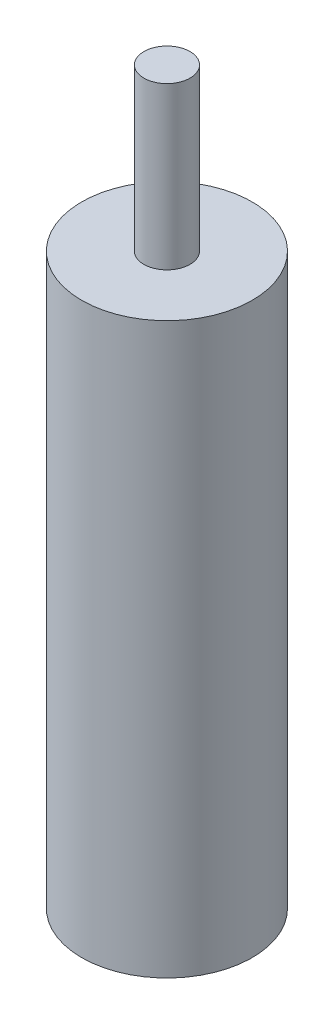
ISO-10303-21;
HEADER;
FILE_DESCRIPTION(('STEP AP214'),'2;1');
FILE_NAME('part.step','',(''),(''),'','','');
FILE_SCHEMA(('AUTOMOTIVE_DESIGN { 1 0 10303 214 1 1 1 1 }'));
ENDSEC;
DATA;
#1=APPLICATION_CONTEXT('core data for automotive mechanical design processes');
#2=APPLICATION_PROTOCOL_DEFINITION('international standard','automotive_design',2000,#1);
#3=PRODUCT_CONTEXT('',#1,'mechanical');
#4=PRODUCT('Part','Part','',(#3));
#5=PRODUCT_RELATED_PRODUCT_CATEGORY('part','',(#4));
#6=PRODUCT_DEFINITION_FORMATION('','',#4);
#7=PRODUCT_DEFINITION_CONTEXT('part definition',#1,'design');
#8=PRODUCT_DEFINITION('design','',#6,#7);
#9=PRODUCT_DEFINITION_SHAPE('','',#8);
#10=(LENGTH_UNIT() NAMED_UNIT(*) SI_UNIT(.MILLI.,.METRE.));
#11=(NAMED_UNIT(*) PLANE_ANGLE_UNIT() SI_UNIT($,.RADIAN.));
#12=(NAMED_UNIT(*) SI_UNIT($,.STERADIAN.) SOLID_ANGLE_UNIT());
#13=UNCERTAINTY_MEASURE_WITH_UNIT(LENGTH_MEASURE(1.E-05),#10,'distance_accuracy_value','');
#14=(GEOMETRIC_REPRESENTATION_CONTEXT(3) GLOBAL_UNCERTAINTY_ASSIGNED_CONTEXT((#13)) GLOBAL_UNIT_ASSIGNED_CONTEXT((#10,
#11,#12)) REPRESENTATION_CONTEXT('',''));
#15=CARTESIAN_POINT('',(0.,0.,0.));
#16=DIRECTION('',(0.,0.,1.));
#17=DIRECTION('',(1.,0.,0.));
#18=AXIS2_PLACEMENT_3D('',#15,#16,#17);
#19=CARTESIAN_POINT('',(0.,123.5,0.));
#20=DIRECTION('',(0.,-1.,0.));
#21=DIRECTION('',(0.,0.,-1.));
#22=AXIS2_PLACEMENT_3D('',#19,#20,#21);
#23=CYLINDRICAL_SURFACE('',#22,18.5);
#24=CARTESIAN_POINT('',(0.,123.5,0.));
#25=DIRECTION('',(0.,1.,0.));
#26=DIRECTION('',(0.,0.,1.));
#27=AXIS2_PLACEMENT_3D('',#24,#25,#26);
#28=CIRCLE('',#27,18.5);
#29=CARTESIAN_POINT('',(0.,123.5,18.5));
#30=VERTEX_POINT('',#29);
#31=EDGE_CURVE('E49',#30,#30,#28,.T.);
#32=ORIENTED_EDGE('',*,*,#31,.F.);
#33=EDGE_LOOP('',(#32));
#34=FACE_BOUND('',#33,.T.);
#35=CARTESIAN_POINT('',(0.,0.,0.));
#36=DIRECTION('',(0.,1.,0.));
#37=DIRECTION('',(0.,0.,1.));
#38=AXIS2_PLACEMENT_3D('',#35,#36,#37);
#39=CIRCLE('',#38,18.5);
#40=CARTESIAN_POINT('',(0.,0.,18.5));
#41=VERTEX_POINT('',#40);
#42=EDGE_CURVE('E44',#41,#41,#39,.T.);
#43=ORIENTED_EDGE('',*,*,#42,.T.);
#44=EDGE_LOOP('',(#43));
#45=FACE_BOUND('',#44,.T.);
#46=ADVANCED_FACE('F41',(#34,#45),#23,.T.);
#47=CARTESIAN_POINT('',(0.,123.5,0.));
#48=DIRECTION('',(0.,1.,0.));
#49=DIRECTION('',(0.,0.,1.));
#50=AXIS2_PLACEMENT_3D('',#47,#48,#49);
#51=PLANE('',#50);
#52=CARTESIAN_POINT('',(0.,123.5,0.));
#53=DIRECTION('',(0.,1.,0.));
#54=DIRECTION('',(0.,0.,1.));
#55=AXIS2_PLACEMENT_3D('',#52,#53,#54);
#56=CIRCLE('',#55,5.);
#57=CARTESIAN_POINT('',(0.,123.5,5.));
#58=VERTEX_POINT('',#57);
#59=EDGE_CURVE('E10',#58,#58,#56,.T.);
#60=ORIENTED_EDGE('',*,*,#59,.F.);
#61=EDGE_LOOP('',(#60));
#62=FACE_BOUND('',#61,.T.);
#63=ORIENTED_EDGE('',*,*,#31,.T.);
#64=EDGE_LOOP('',(#63));
#65=FACE_BOUND('',#64,.T.);
#66=ADVANCED_FACE('F69',(#62,#65),#51,.T.);
#67=CARTESIAN_POINT('',(0.,0.,0.));
#68=DIRECTION('',(0.,1.,0.));
#69=DIRECTION('',(0.,0.,1.));
#70=AXIS2_PLACEMENT_3D('',#67,#68,#69);
#71=PLANE('',#70);
#72=ORIENTED_EDGE('',*,*,#42,.F.);
#73=EDGE_LOOP('',(#72));
#74=FACE_BOUND('',#73,.T.);
#75=ADVANCED_FACE('F66',(#74),#71,.F.);
#76=CARTESIAN_POINT('',(0.,158.5,0.));
#77=DIRECTION('',(0.,-1.,0.));
#78=DIRECTION('',(0.,0.,-1.));
#79=AXIS2_PLACEMENT_3D('',#76,#77,#78);
#80=CYLINDRICAL_SURFACE('',#79,5.);
#81=CARTESIAN_POINT('',(0.,158.5,0.));
#82=DIRECTION('',(0.,1.,0.));
#83=DIRECTION('',(0.,0.,1.));
#84=AXIS2_PLACEMENT_3D('',#81,#82,#83);
#85=CIRCLE('',#84,5.);
#86=CARTESIAN_POINT('',(0.,158.5,5.));
#87=VERTEX_POINT('',#86);
#88=EDGE_CURVE('E56',#87,#87,#85,.T.);
#89=ORIENTED_EDGE('',*,*,#88,.F.);
#90=EDGE_LOOP('',(#89));
#91=FACE_BOUND('',#90,.T.);
#92=ORIENTED_EDGE('',*,*,#59,.T.);
#93=EDGE_LOOP('',(#92));
#94=FACE_BOUND('',#93,.T.);
#95=ADVANCED_FACE('F68',(#91,#94),#80,.T.);
#96=CARTESIAN_POINT('',(0.,158.5,0.));
#97=DIRECTION('',(0.,1.,0.));
#98=DIRECTION('',(0.,0.,1.));
#99=AXIS2_PLACEMENT_3D('',#96,#97,#98);
#100=PLANE('',#99);
#101=ORIENTED_EDGE('',*,*,#88,.T.);
#102=EDGE_LOOP('',(#101));
#103=FACE_BOUND('',#102,.T.);
#104=ADVANCED_FACE('F74',(#103),#100,.T.);
#105=CLOSED_SHELL('',(#46,#66,#75,#95,#104));
#106=MANIFOLD_SOLID_BREP('B2',#105);
#107=ADVANCED_BREP_SHAPE_REPRESENTATION('',(#18,#106),#14);
#108=SHAPE_DEFINITION_REPRESENTATION(#9,#107);
ENDSEC;
END-ISO-10303-21;
